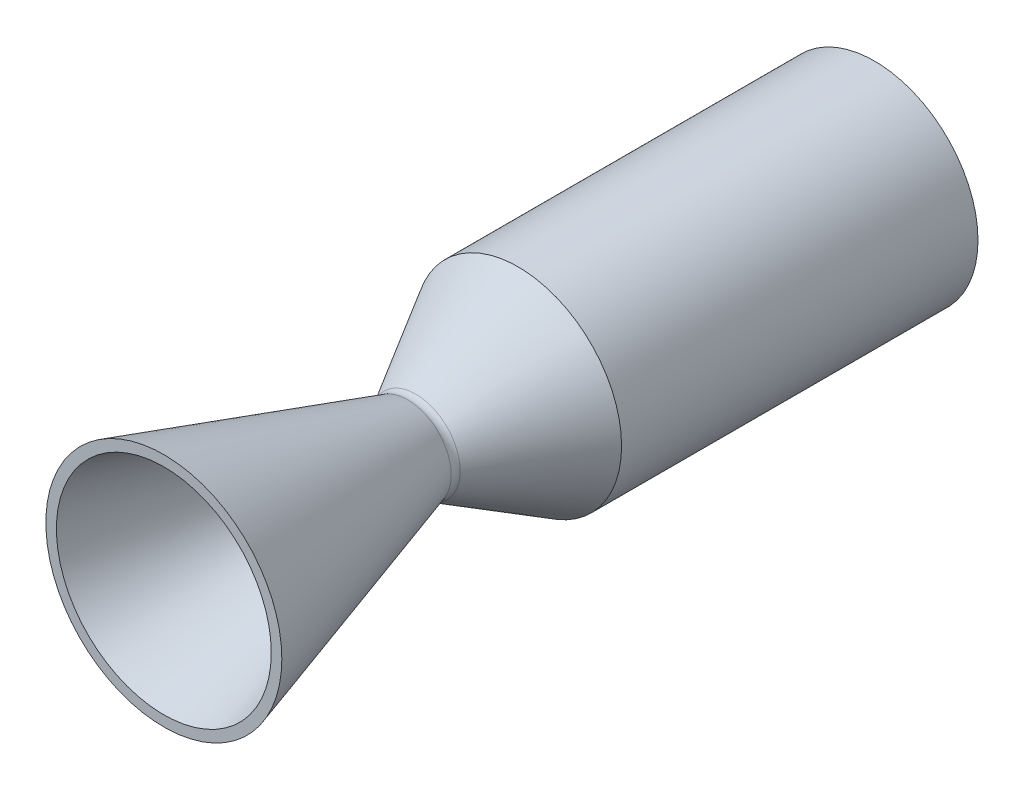
ISO-10303-21;
HEADER;
FILE_DESCRIPTION(('STEP AP214'),'2;1');
FILE_NAME('part.step','',(''),(''),'','','');
FILE_SCHEMA(('AUTOMOTIVE_DESIGN { 1 0 10303 214 1 1 1 1 }'));
ENDSEC;
DATA;
#1=APPLICATION_CONTEXT('core data for automotive mechanical design processes');
#2=APPLICATION_PROTOCOL_DEFINITION('international standard','automotive_design',2000,#1);
#3=PRODUCT_CONTEXT('',#1,'mechanical');
#4=PRODUCT('Part','Part','',(#3));
#5=PRODUCT_RELATED_PRODUCT_CATEGORY('part','',(#4));
#6=PRODUCT_DEFINITION_FORMATION('','',#4);
#7=PRODUCT_DEFINITION_CONTEXT('part definition',#1,'design');
#8=PRODUCT_DEFINITION('design','',#6,#7);
#9=PRODUCT_DEFINITION_SHAPE('','',#8);
#10=(LENGTH_UNIT() NAMED_UNIT(*) SI_UNIT(.MILLI.,.METRE.));
#11=(NAMED_UNIT(*) PLANE_ANGLE_UNIT() SI_UNIT($,.RADIAN.));
#12=(NAMED_UNIT(*) SI_UNIT($,.STERADIAN.) SOLID_ANGLE_UNIT());
#13=UNCERTAINTY_MEASURE_WITH_UNIT(LENGTH_MEASURE(1.E-05),#10,'distance_accuracy_value','');
#14=(GEOMETRIC_REPRESENTATION_CONTEXT(3) GLOBAL_UNCERTAINTY_ASSIGNED_CONTEXT((#13)) GLOBAL_UNIT_ASSIGNED_CONTEXT((#10,
#11,#12)) REPRESENTATION_CONTEXT('',''));
#15=CARTESIAN_POINT('',(0.,0.,0.));
#16=DIRECTION('',(0.,0.,1.));
#17=DIRECTION('',(1.,0.,0.));
#18=AXIS2_PLACEMENT_3D('',#15,#16,#17);
#19=CARTESIAN_POINT('',(0.,0.,98.6480898452624));
#20=DIRECTION('',(0.,0.,1.));
#21=DIRECTION('',(1.,0.,0.));
#22=AXIS2_PLACEMENT_3D('',#19,#20,#21);
#23=CYLINDRICAL_SURFACE('',#22,26.0076810940689);
#24=CARTESIAN_POINT('',(0.,0.,0.680590948775053));
#25=DIRECTION('',(0.,0.,1.));
#26=DIRECTION('',(1.,0.,0.));
#27=AXIS2_PLACEMENT_3D('',#24,#25,#26);
#28=CIRCLE('',#27,26.0076810940689);
#29=CARTESIAN_POINT('',(26.0076810940689,0.,0.680590948775053));
#30=VERTEX_POINT('',#29);
#31=EDGE_CURVE('E59',#30,#30,#28,.T.);
#32=ORIENTED_EDGE('',*,*,#31,.F.);
#33=EDGE_LOOP('',(#32));
#34=FACE_BOUND('',#33,.T.);
#35=CARTESIAN_POINT('',(0.,0.,-88.9));
#36=DIRECTION('',(0.,0.,1.));
#37=DIRECTION('',(1.,0.,0.));
#38=AXIS2_PLACEMENT_3D('',#35,#36,#37);
#39=CIRCLE('',#38,26.0076810940689);
#40=CARTESIAN_POINT('',(26.0076810940689,0.,-88.9));
#41=VERTEX_POINT('',#40);
#42=EDGE_CURVE('E10',#41,#41,#39,.T.);
#43=ORIENTED_EDGE('',*,*,#42,.T.);
#44=EDGE_LOOP('',(#43));
#45=FACE_BOUND('',#44,.T.);
#46=ADVANCED_FACE('F51',(#34,#45),#23,.T.);
#47=CARTESIAN_POINT('',(0.,0.,0.680590948775053));
#48=DIRECTION('',(0.,0.,-1.));
#49=DIRECTION('',(-1.,0.,0.));
#50=AXIS2_PLACEMENT_3D('',#47,#48,#49);
#51=CONICAL_SURFACE('',#50,26.0076810940689,0.523598775598299);
#52=CARTESIAN_POINT('',(0.,0.,26.4023591874235));
#53=DIRECTION('',(0.,0.,1.));
#54=DIRECTION('',(1.,0.,0.));
#55=AXIS2_PLACEMENT_3D('',#52,#53,#54);
#56=CIRCLE('',#55,11.157211277452);
#57=CARTESIAN_POINT('',(11.157211277452,0.,26.4023591874235));
#58=VERTEX_POINT('',#57);
#59=EDGE_CURVE('E66',#58,#58,#56,.T.);
#60=ORIENTED_EDGE('',*,*,#59,.F.);
#61=EDGE_LOOP('',(#60));
#62=FACE_BOUND('',#61,.T.);
#63=ORIENTED_EDGE('',*,*,#31,.T.);
#64=EDGE_LOOP('',(#63));
#65=FACE_BOUND('',#64,.T.);
#66=ADVANCED_FACE('F120',(#62,#65),#51,.T.);
#67=CARTESIAN_POINT('',(0.,0.,27.6723591874235));
#68=DIRECTION('',(0.,0.,1.));
#69=DIRECTION('',(1.,0.,0.));
#70=AXIS2_PLACEMENT_3D('',#67,#68,#69);
#71=TOROIDAL_SURFACE('',#70,13.3569158030645,2.54);
#72=CARTESIAN_POINT('',(0.,0.,28.414485615538));
#73=DIRECTION('',(0.,0.,1.));
#74=DIRECTION('',(1.,0.,0.));
#75=AXIS2_PLACEMENT_3D('',#72,#73,#74);
#76=CIRCLE('',#75,10.9277496159349);
#77=CARTESIAN_POINT('',(10.9277496159349,0.,28.414485615538));
#78=VERTEX_POINT('',#77);
#79=EDGE_CURVE('E73',#78,#78,#76,.T.);
#80=ORIENTED_EDGE('',*,*,#79,.F.);
#81=EDGE_LOOP('',(#80));
#82=FACE_BOUND('',#81,.T.);
#83=ORIENTED_EDGE('',*,*,#59,.T.);
#84=EDGE_LOOP('',(#83));
#85=FACE_BOUND('',#84,.T.);
#86=ADVANCED_FACE('F114',(#82,#85),#71,.F.);
#87=CARTESIAN_POINT('',(0.,0.,88.975101995945));
#88=DIRECTION('',(0.,0.,1.));
#89=DIRECTION('',(1.,0.,0.));
#90=AXIS2_PLACEMENT_3D('',#87,#88,#89);
#91=CONICAL_SURFACE('',#90,29.4294207477522,0.296501080532815);
#92=CARTESIAN_POINT('',(0.,0.,89.7172284240595));
#93=DIRECTION('',(0.,0.,1.));
#94=DIRECTION('',(1.,0.,0.));
#95=AXIS2_PLACEMENT_3D('',#92,#93,#94);
#96=CIRCLE('',#95,29.6561453079013);
#97=CARTESIAN_POINT('',(29.6561453079013,0.,89.7172284240595));
#98=VERTEX_POINT('',#97);
#99=EDGE_CURVE('E79',#98,#98,#96,.T.);
#100=ORIENTED_EDGE('',*,*,#99,.F.);
#101=EDGE_LOOP('',(#100));
#102=FACE_BOUND('',#101,.T.);
#103=ORIENTED_EDGE('',*,*,#79,.T.);
#104=EDGE_LOOP('',(#103));
#105=FACE_BOUND('',#104,.T.);
#106=ADVANCED_FACE('F109',(#102,#105),#91,.T.);
#107=CARTESIAN_POINT('',(0.,0.,89.7172284240595));
#108=DIRECTION('',(0.,0.,1.));
#109=DIRECTION('',(1.,0.,0.));
#110=AXIS2_PLACEMENT_3D('',#107,#108,#109);
#111=PLANE('',#110);
#112=CARTESIAN_POINT('',(0.,0.,89.7172284240595));
#113=DIRECTION('',(0.,0.,1.));
#114=DIRECTION('',(1.,0.,0.));
#115=AXIS2_PLACEMENT_3D('',#112,#113,#114);
#116=CIRCLE('',#115,27.0002545606226);
#117=CARTESIAN_POINT('',(27.0002545606226,0.,89.7172284240595));
#118=VERTEX_POINT('',#117);
#119=EDGE_CURVE('E98',#118,#118,#116,.T.);
#120=ORIENTED_EDGE('',*,*,#119,.F.);
#121=EDGE_LOOP('',(#120));
#122=FACE_BOUND('',#121,.T.);
#123=ORIENTED_EDGE('',*,*,#99,.T.);
#124=EDGE_LOOP('',(#123));
#125=FACE_BOUND('',#124,.T.);
#126=ADVANCED_FACE('F106',(#122,#125),#111,.T.);
#127=CARTESIAN_POINT('',(0.,0.,-88.9));
#128=DIRECTION('',(0.,0.,1.));
#129=DIRECTION('',(1.,0.,0.));
#130=AXIS2_PLACEMENT_3D('',#127,#128,#129);
#131=PLANE('',#130);
#132=CARTESIAN_POINT('',(0.,0.,-88.9));
#133=DIRECTION('',(0.,0.,1.));
#134=DIRECTION('',(1.,0.,0.));
#135=AXIS2_PLACEMENT_3D('',#132,#133,#134);
#136=CIRCLE('',#135,23.4676810940689);
#137=CARTESIAN_POINT('',(23.4676810940689,0.,-88.9));
#138=VERTEX_POINT('',#137);
#139=EDGE_CURVE('E82',#138,#138,#136,.T.);
#140=ORIENTED_EDGE('',*,*,#139,.T.);
#141=EDGE_LOOP('',(#140));
#142=FACE_BOUND('',#141,.T.);
#143=ORIENTED_EDGE('',*,*,#42,.F.);
#144=EDGE_LOOP('',(#143));
#145=FACE_BOUND('',#144,.T.);
#146=ADVANCED_FACE('F53',(#142,#145),#131,.F.);
#147=CARTESIAN_POINT('',(0.,0.,98.6480898452624));
#148=DIRECTION('',(0.,0.,1.));
#149=DIRECTION('',(1.,0.,0.));
#150=AXIS2_PLACEMENT_3D('',#147,#148,#149);
#151=CYLINDRICAL_SURFACE('',#150,23.4676810940689);
#152=CARTESIAN_POINT('',(0.,0.,0.));
#153=DIRECTION('',(0.,0.,1.));
#154=DIRECTION('',(1.,0.,0.));
#155=AXIS2_PLACEMENT_3D('',#152,#153,#154);
#156=CIRCLE('',#155,23.4676810940689);
#157=CARTESIAN_POINT('',(23.4676810940689,0.,0.));
#158=VERTEX_POINT('',#157);
#159=EDGE_CURVE('E86',#158,#158,#156,.T.);
#160=ORIENTED_EDGE('',*,*,#159,.T.);
#161=EDGE_LOOP('',(#160));
#162=FACE_BOUND('',#161,.T.);
#163=ORIENTED_EDGE('',*,*,#139,.F.);
#164=EDGE_LOOP('',(#163));
#165=FACE_BOUND('',#164,.T.);
#166=ADVANCED_FACE('F131',(#162,#165),#151,.F.);
#167=CARTESIAN_POINT('',(0.,0.,0.));
#168=DIRECTION('',(0.,0.,-1.));
#169=DIRECTION('',(-1.,0.,0.));
#170=AXIS2_PLACEMENT_3D('',#167,#168,#169);
#171=CONICAL_SURFACE('',#170,23.4676810940689,0.523598775598299);
#172=CARTESIAN_POINT('',(0.,0.,26.088549991769));
#173=DIRECTION('',(0.,0.,1.));
#174=DIRECTION('',(1.,0.,0.));
#175=AXIS2_PLACEMENT_3D('',#172,#173,#174);
#176=CIRCLE('',#175,8.40544973355408);
#177=CARTESIAN_POINT('',(8.40544973355408,0.,26.088549991769));
#178=VERTEX_POINT('',#177);
#179=EDGE_CURVE('E90',#178,#178,#176,.T.);
#180=ORIENTED_EDGE('',*,*,#179,.T.);
#181=EDGE_LOOP('',(#180));
#182=FACE_BOUND('',#181,.T.);
#183=ORIENTED_EDGE('',*,*,#159,.F.);
#184=EDGE_LOOP('',(#183));
#185=FACE_BOUND('',#184,.T.);
#186=ADVANCED_FACE('F134',(#182,#185),#171,.F.);
#187=CARTESIAN_POINT('',(0.,0.,27.358549991769));
#188=DIRECTION('',(0.,0.,1.));
#189=DIRECTION('',(1.,0.,0.));
#190=AXIS2_PLACEMENT_3D('',#187,#188,#189);
#191=TOROIDAL_SURFACE('',#190,10.6051542591666,2.54);
#192=ORIENTED_EDGE('',*,*,#179,.F.);
#193=EDGE_LOOP('',(#192));
#194=FACE_BOUND('',#193,.T.);
#195=CARTESIAN_POINT('',(0.,0.,28.1006764198835));
#196=DIRECTION('',(0.,0.,1.));
#197=DIRECTION('',(1.,0.,0.));
#198=AXIS2_PLACEMENT_3D('',#195,#196,#197);
#199=CIRCLE('',#198,8.1759880720369);
#200=CARTESIAN_POINT('',(8.1759880720369,0.,28.1006764198835));
#201=VERTEX_POINT('',#200);
#202=EDGE_CURVE('E94',#201,#201,#199,.T.);
#203=ORIENTED_EDGE('',*,*,#202,.T.);
#204=EDGE_LOOP('',(#203));
#205=FACE_BOUND('',#204,.T.);
#206=ADVANCED_FACE('F138',(#194,#205),#191,.T.);
#207=CARTESIAN_POINT('',(0.,0.,28.1006764198835));
#208=DIRECTION('',(0.,0.,1.));
#209=DIRECTION('',(1.,0.,0.));
#210=AXIS2_PLACEMENT_3D('',#207,#208,#209);
#211=CONICAL_SURFACE('',#210,8.1759880720369,0.296501080532809);
#212=CARTESIAN_POINT('',(27.0002545606226,0.,89.7172284240595));
#213=CARTESIAN_POINT('',(26.8041684513665,0.,89.0753893406826));
#214=CARTESIAN_POINT('',(26.6080823421104,0.,88.4335502573058));
#215=CARTESIAN_POINT('',(26.2159101235982,0.,87.1498720905521));
#216=CARTESIAN_POINT('',(26.0198240143421,0.,86.5080330071753));
#217=CARTESIAN_POINT('',(25.6276517958299,0.,85.2243548404216));
#218=CARTESIAN_POINT('',(25.4315656865738,0.,84.5825157570448));
#219=CARTESIAN_POINT('',(25.0393934680616,0.,83.2988375902911));
#220=CARTESIAN_POINT('',(24.8433073588055,0.,82.6569985069143));
#221=CARTESIAN_POINT('',(24.4511351402933,0.,81.3733203401606));
#222=CARTESIAN_POINT('',(24.2550490310372,0.,80.7314812567838));
#223=CARTESIAN_POINT('',(23.862876812525,0.,79.4478030900301));
#224=CARTESIAN_POINT('',(23.6667907032689,0.,78.8059640066533));
#225=CARTESIAN_POINT('',(23.2746184847567,0.,77.5222858398997));
#226=CARTESIAN_POINT('',(23.0785323755006,0.,76.8804467565228));
#227=CARTESIAN_POINT('',(22.6863601569884,0.,75.5967685897691));
#228=CARTESIAN_POINT('',(22.4902740477323,0.,74.9549295063923));
#229=CARTESIAN_POINT('',(22.0981018292201,0.,73.6712513396386));
#230=CARTESIAN_POINT('',(21.902015719964,0.,73.0294122562618));
#231=CARTESIAN_POINT('',(21.5098435014518,0.,71.7457340895081));
#232=CARTESIAN_POINT('',(21.3137573921957,0.,71.1038950061313));
#233=CARTESIAN_POINT('',(20.9215851736835,0.,69.8202168393776));
#234=CARTESIAN_POINT('',(20.7254990644274,0.,69.1783777560008));
#235=CARTESIAN_POINT('',(20.3333268459152,0.,67.8946995892471));
#236=CARTESIAN_POINT('',(20.137240736659,0.,67.2528605058703));
#237=CARTESIAN_POINT('',(19.7450685181469,0.,65.9691823391166));
#238=CARTESIAN_POINT('',(19.5489824088908,0.,65.3273432557398));
#239=CARTESIAN_POINT('',(19.1568101903786,0.,64.0436650889861));
#240=CARTESIAN_POINT('',(18.9607240811224,0.,63.4018260056093));
#241=CARTESIAN_POINT('',(18.5685518626102,0.,62.1181478388556));
#242=CARTESIAN_POINT('',(18.3724657533541,0.,61.4763087554788));
#243=CARTESIAN_POINT('',(17.9802935348419,0.,60.1926305887251));
#244=CARTESIAN_POINT('',(17.7842074255858,0.,59.5507915053483));
#245=CARTESIAN_POINT('',(17.3920352070736,0.,58.2671133385946));
#246=CARTESIAN_POINT('',(17.1959490978175,0.,57.6252742552178));
#247=CARTESIAN_POINT('',(16.8037768793053,0.,56.3415960884641));
#248=CARTESIAN_POINT('',(16.6076907700492,0.,55.6997570050873));
#249=CARTESIAN_POINT('',(16.215518551537,0.,54.4160788383336));
#250=CARTESIAN_POINT('',(16.0194324422809,0.,53.7742397549568));
#251=CARTESIAN_POINT('',(15.6272602237687,0.,52.4905615882031));
#252=CARTESIAN_POINT('',(15.4311741145126,0.,51.8487225048263));
#253=CARTESIAN_POINT('',(15.0390018960004,0.,50.5650443380726));
#254=CARTESIAN_POINT('',(14.8429157867443,0.,49.9232052546958));
#255=CARTESIAN_POINT('',(14.4507435682321,0.,48.6395270879421));
#256=CARTESIAN_POINT('',(14.254657458976,0.,47.9976880045653));
#257=CARTESIAN_POINT('',(13.8624852404638,0.,46.7140098378116));
#258=CARTESIAN_POINT('',(13.6663991312077,0.,46.0721707544348));
#259=CARTESIAN_POINT('',(13.2742269126955,0.,44.7884925876811));
#260=CARTESIAN_POINT('',(13.0781408034394,0.,44.1466535043043));
#261=CARTESIAN_POINT('',(12.6859685849272,0.,42.8629753375506));
#262=CARTESIAN_POINT('',(12.4898824756711,0.,42.2211362541738));
#263=CARTESIAN_POINT('',(12.0977102571589,0.,40.9374580874201));
#264=CARTESIAN_POINT('',(11.9016241479028,0.,40.2956190040433));
#265=CARTESIAN_POINT('',(11.5094519293906,0.,39.0119408372896));
#266=CARTESIAN_POINT('',(11.3133658201345,0.,38.3701017539128));
#267=CARTESIAN_POINT('',(10.9211936016223,0.,37.0864235871591));
#268=CARTESIAN_POINT('',(10.7251074923662,0.,36.4445845037823));
#269=CARTESIAN_POINT('',(10.332935273854,0.,35.1609063370286));
#270=CARTESIAN_POINT('',(10.1368491645979,0.,34.5190672536518));
#271=CARTESIAN_POINT('',(9.74467694608571,0.,33.2353890868981));
#272=CARTESIAN_POINT('',(9.54859083682961,0.,32.5935500035213));
#273=CARTESIAN_POINT('',(9.1564186183174,0.,31.3098718367676));
#274=CARTESIAN_POINT('',(8.9603325090613,0.,30.6680327533908));
#275=CARTESIAN_POINT('',(8.5681602905491,0.,29.3843545866371));
#276=CARTESIAN_POINT('',(8.372074181293,0.,28.7425155032603));
#277=CARTESIAN_POINT('',(8.1759880720369,0.,28.1006764198835));
#278=B_SPLINE_CURVE_WITH_KNOTS('',3,(#212,#213,#214,#215,#216,#217,#218,#219,#220,#221,#222,
#223,#224,#225,#226,#227,#228,#229,#230,#231,#232,#233,#234,#235,#236,#237,#238,#239,#240,#241,
#242,#243,#244,#245,#246,#247,#248,#249,#250,#251,#252,#253,#254,#255,#256,#257,#258,#259,#260,
#261,#262,#263,#264,#265,#266,#267,#268,#269,#270,#271,#272,#273,#274,#275,#276,#277),
.UNSPECIFIED.,.F.,.F.,(4,2,2,2,2,2,2,2,2,2,2,2,2,2,2,2,2,2,2,2,2,2,2,2,2,2,2,2,2,2,2,2,4),(0.,
2.01337143635716,4.02674287271432,6.04011430907148,8.05348574542863,10.0668571817858,
12.0802286181429,14.0936000545001,16.1069714908573,18.1203429272144,20.1337143635716,
22.1470857999287,24.1604572362859,26.173828672643,28.1872001090002,30.2005715453574,
32.2139429817145,34.2273144180717,36.2406858544288,38.254057290786,40.2674287271432,
42.2808001635003,44.2941715998575,46.3075430362146,48.3209144725718,50.3342859089289,
52.3476573452861,54.3610287816433,56.3744002180004,58.3877716543576,60.4011430907147,
62.4145145270719,64.427885963429),.UNSPECIFIED.);
#279=EDGE_CURVE('BSEAM103',#118,#201,#278,.T.);
#280=ORIENTED_EDGE('',*,*,#119,.T.);
#281=ORIENTED_EDGE('',*,*,#202,.F.);
#282=ORIENTED_EDGE('',*,*,#279,.T.);
#283=ORIENTED_EDGE('',*,*,#279,.F.);
#284=EDGE_LOOP('',(#280,#282,#281,#283));
#285=FACE_BOUND('',#284,.T.);
#286=ADVANCED_FACE('F103',(#285),#211,.F.);
#287=CLOSED_SHELL('',(#46,#66,#86,#106,#126,#146,#166,#186,#206,#286));
#288=MANIFOLD_SOLID_BREP('B2',#287);
#289=ADVANCED_BREP_SHAPE_REPRESENTATION('',(#18,#288),#14);
#290=SHAPE_DEFINITION_REPRESENTATION(#9,#289);
ENDSEC;
END-ISO-10303-21;
